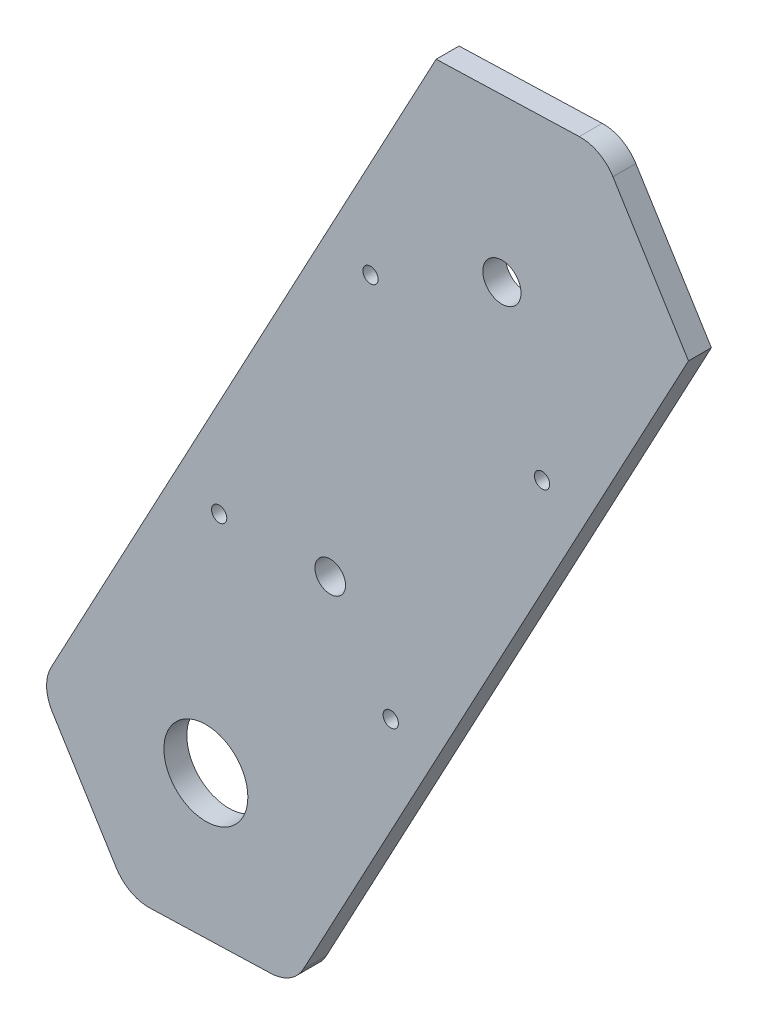
ISO-10303-21;
HEADER;
FILE_DESCRIPTION(('STEP AP214'),'2;1');
FILE_NAME('part.step','',(''),(''),'','','');
FILE_SCHEMA(('AUTOMOTIVE_DESIGN { 1 0 10303 214 1 1 1 1 }'));
ENDSEC;
DATA;
#1=APPLICATION_CONTEXT('core data for automotive mechanical design processes');
#2=APPLICATION_PROTOCOL_DEFINITION('international standard','automotive_design',2000,#1);
#3=PRODUCT_CONTEXT('',#1,'mechanical');
#4=PRODUCT('Part','Part','',(#3));
#5=PRODUCT_RELATED_PRODUCT_CATEGORY('part','',(#4));
#6=PRODUCT_DEFINITION_FORMATION('','',#4);
#7=PRODUCT_DEFINITION_CONTEXT('part definition',#1,'design');
#8=PRODUCT_DEFINITION('design','',#6,#7);
#9=PRODUCT_DEFINITION_SHAPE('','',#8);
#10=(LENGTH_UNIT() NAMED_UNIT(*) SI_UNIT(.MILLI.,.METRE.));
#11=(NAMED_UNIT(*) PLANE_ANGLE_UNIT() SI_UNIT($,.RADIAN.));
#12=(NAMED_UNIT(*) SI_UNIT($,.STERADIAN.) SOLID_ANGLE_UNIT());
#13=UNCERTAINTY_MEASURE_WITH_UNIT(LENGTH_MEASURE(1.E-05),#10,'distance_accuracy_value','');
#14=(GEOMETRIC_REPRESENTATION_CONTEXT(3) GLOBAL_UNCERTAINTY_ASSIGNED_CONTEXT((#13)) GLOBAL_UNIT_ASSIGNED_CONTEXT((#10,
#11,#12)) REPRESENTATION_CONTEXT('',''));
#15=CARTESIAN_POINT('',(0.,0.,0.));
#16=DIRECTION('',(0.,0.,1.));
#17=DIRECTION('',(1.,0.,0.));
#18=AXIS2_PLACEMENT_3D('',#15,#16,#17);
#19=CARTESIAN_POINT('',(-59.7156540331913,92.8676336023535,6.));
#20=DIRECTION('',(0.,0.,1.));
#21=DIRECTION('',(1.,0.,0.));
#22=AXIS2_PLACEMENT_3D('',#19,#20,#21);
#23=PLANE('',#22);
#24=CARTESIAN_POINT('',(-72.9831925429008,180.369292488009,6.));
#25=DIRECTION('',(0.,0.,1.));
#26=DIRECTION('',(1.,0.,0.));
#27=AXIS2_PLACEMENT_3D('',#24,#25,#26);
#28=CIRCLE('',#27,2.00000000000215);
#29=CARTESIAN_POINT('',(-70.9831925428986,180.369292488009,6.));
#30=VERTEX_POINT('',#29);
#31=EDGE_CURVE('E244',#30,#30,#28,.T.);
#32=ORIENTED_EDGE('',*,*,#31,.F.);
#33=EDGE_LOOP('',(#32));
#34=FACE_BOUND('',#33,.T.);
#35=CARTESIAN_POINT('',(-28.0225409238831,156.295659484383,6.));
#36=DIRECTION('',(0.,0.,1.));
#37=DIRECTION('',(1.,0.,0.));
#38=AXIS2_PLACEMENT_3D('',#35,#36,#37);
#39=CIRCLE('',#38,1.99999999999847);
#40=CARTESIAN_POINT('',(-26.0225409238846,156.295659484383,6.));
#41=VERTEX_POINT('',#40);
#42=EDGE_CURVE('E232',#41,#41,#39,.T.);
#43=ORIENTED_EDGE('',*,*,#42,.F.);
#44=EDGE_LOOP('',(#43));
#45=FACE_BOUND('',#44,.T.);
#46=CARTESIAN_POINT('',(-33.3325028898582,254.422130448743,6.));
#47=DIRECTION('',(0.,0.,1.));
#48=DIRECTION('',(1.,0.,0.));
#49=AXIS2_PLACEMENT_3D('',#46,#47,#48);
#50=CIRCLE('',#49,2.0000000000014);
#51=CARTESIAN_POINT('',(-31.3325028898568,254.422130448743,6.));
#52=VERTEX_POINT('',#51);
#53=EDGE_CURVE('E220',#52,#52,#50,.T.);
#54=ORIENTED_EDGE('',*,*,#53,.F.);
#55=EDGE_LOOP('',(#54));
#56=FACE_BOUND('',#55,.T.);
#57=CARTESIAN_POINT('',(-59.7156540331913,92.8676336023535,6.));
#58=DIRECTION('',(0.,0.,1.));
#59=DIRECTION('',(1.,0.,0.));
#60=AXIS2_PLACEMENT_3D('',#57,#58,#59);
#61=CIRCLE('',#60,9.99999999999937);
#62=CARTESIAN_POINT('',(-59.3956642161356,82.8727545877296,6.));
#63=VERTEX_POINT('',#62);
#64=CARTESIAN_POINT('',(-50.8998399902472,88.1473134055641,6.));
#65=VERTEX_POINT('',#64);
#66=EDGE_CURVE('E169',#63,#65,#61,.T.);
#67=ORIENTED_EDGE('',*,*,#66,.T.);
#68=DIRECTION('',(0.472032019678965,0.881581404294463,0.));
#69=VECTOR('',#68,1.);
#70=CARTESIAN_POINT('',(-50.8998399902472,88.1473134055641,6.));
#71=LINE('',#70,#69);
#72=CARTESIAN_POINT('',(49.9944768524182,276.58061839191,6.));
#73=VERTEX_POINT('',#72);
#74=EDGE_CURVE('E107',#65,#73,#71,.T.);
#75=ORIENTED_EDGE('',*,*,#74,.T.);
#76=DIRECTION('',(-0.52745588178346,0.849582422588905,0.));
#77=VECTOR('',#76,1.);
#78=CARTESIAN_POINT('',(49.9944768524182,276.58061839191,6.));
#79=LINE('',#78,#77);
#80=CARTESIAN_POINT('',(30.200235155752,308.463550016641,6.));
#81=VERTEX_POINT('',#80);
#82=EDGE_CURVE('E190',#73,#81,#79,.T.);
#83=ORIENTED_EDGE('',*,*,#82,.T.);
#84=CARTESIAN_POINT('',(21.7044109298635,303.188991198806,6.));
#85=DIRECTION('',(0.,0.,1.));
#86=DIRECTION('',(1.,0.,0.));
#87=AXIS2_PLACEMENT_3D('',#84,#85,#86);
#88=CIRCLE('',#87,9.9999999999994);
#89=CARTESIAN_POINT('',(21.384421112808,313.18387021343,6.));
#90=VERTEX_POINT('',#89);
#91=EDGE_CURVE('E209',#81,#90,#88,.T.);
#92=ORIENTED_EDGE('',*,*,#91,.T.);
#93=DIRECTION('',(-0.999487901462448,-0.0319989817055542,0.));
#94=VECTOR('',#93,1.);
#95=CARTESIAN_POINT('',(21.384421112808,313.18387021343,6.));
#96=LINE('',#95,#94);
#97=CARTESIAN_POINT('',(-16.124128469664,311.983019867833,6.));
#98=VERTEX_POINT('',#97);
#99=EDGE_CURVE('E206',#90,#98,#96,.T.);
#100=ORIENTED_EDGE('',*,*,#99,.T.);
#101=DIRECTION('',(-0.472032019678973,-0.881581404294459,0.));
#102=VECTOR('',#101,1.);
#103=CARTESIAN_POINT('',(-117.018445312331,123.549714881488,6.));
#104=LINE('',#103,#102);
#105=CARTESIAN_POINT('',(-117.01844531233,123.549714881488,6.));
#106=VERTEX_POINT('',#105);
#107=EDGE_CURVE('E208',#98,#106,#104,.T.);
#108=ORIENTED_EDGE('',*,*,#107,.T.);
#109=CARTESIAN_POINT('',(-108.202631269388,118.829394684697,6.));
#110=DIRECTION('',(0.,0.,1.));
#111=DIRECTION('',(1.,0.,0.));
#112=AXIS2_PLACEMENT_3D('',#109,#110,#111);
#113=CIRCLE('',#112,9.99999999999877);
#114=CARTESIAN_POINT('',(-116.698455495276,113.554835866865,6.));
#115=VERTEX_POINT('',#114);
#116=EDGE_CURVE('E132',#106,#115,#113,.T.);
#117=ORIENTED_EDGE('',*,*,#116,.T.);
#118=DIRECTION('',(0.527455881783426,-0.849582422588926,0.));
#119=VECTOR('',#118,1.);
#120=CARTESIAN_POINT('',(-116.698455495276,113.554835866865,6.));
#121=LINE('',#120,#119);
#122=CARTESIAN_POINT('',(-99.9494817519435,86.5769706459374,6.));
#123=VERTEX_POINT('',#122);
#124=EDGE_CURVE('E126',#115,#123,#121,.T.);
#125=ORIENTED_EDGE('',*,*,#124,.T.);
#126=CARTESIAN_POINT('',(-91.4536575260571,91.8515294637753,6.));
#127=DIRECTION('',(0.,0.,1.));
#128=DIRECTION('',(1.,0.,0.));
#129=AXIS2_PLACEMENT_3D('',#126,#127,#128);
#130=CIRCLE('',#129,9.99999999999952);
#131=CARTESIAN_POINT('',(-91.1336677089969,81.8566504491513,6.));
#132=VERTEX_POINT('',#131);
#133=EDGE_CURVE('E130',#123,#132,#130,.T.);
#134=ORIENTED_EDGE('',*,*,#133,.T.);
#135=DIRECTION('',(0.999487901462452,0.0319989817054318,0.));
#136=VECTOR('',#135,1.);
#137=CARTESIAN_POINT('',(-91.1336677089969,81.8566504491513,6.));
#138=LINE('',#137,#136);
#139=EDGE_CURVE('E58',#132,#63,#138,.T.);
#140=ORIENTED_EDGE('',*,*,#139,.T.);
#141=EDGE_LOOP('',(#67,#75,#83,#92,#100,#108,#117,#125,#134,#140));
#142=FACE_BOUND('',#141,.T.);
#143=CARTESIAN_POINT('',(1.1048299992864,270.012836124958,6.));
#144=DIRECTION('',(0.,0.,1.));
#145=DIRECTION('',(1.,0.,0.));
#146=AXIS2_PLACEMENT_3D('',#143,#144,#145);
#147=CIRCLE('',#146,4.99999999999693);
#148=CARTESIAN_POINT('',(6.10482999928334,270.012836124958,6.));
#149=VERTEX_POINT('',#148);
#150=EDGE_CURVE('E154',#149,#149,#147,.T.);
#151=ORIENTED_EDGE('',*,*,#150,.F.);
#152=EDGE_LOOP('',(#151));
#153=FACE_BOUND('',#152,.T.);
#154=CARTESIAN_POINT('',(11.6281487291572,230.348497445116,6.));
#155=DIRECTION('',(0.,0.,1.));
#156=DIRECTION('',(1.,0.,0.));
#157=AXIS2_PLACEMENT_3D('',#154,#155,#156);
#158=CIRCLE('',#157,1.99999999999782);
#159=CARTESIAN_POINT('',(13.628148729155,230.348497445116,6.));
#160=VERTEX_POINT('',#159);
#161=EDGE_CURVE('E226',#160,#160,#158,.T.);
#162=ORIENTED_EDGE('',*,*,#161,.F.);
#163=EDGE_LOOP('',(#162));
#164=FACE_BOUND('',#163,.T.);
#165=CARTESIAN_POINT('',(-43.8796651517053,180.702169371145,6.));
#166=DIRECTION('',(0.,0.,1.));
#167=DIRECTION('',(1.,0.,0.));
#168=AXIS2_PLACEMENT_3D('',#165,#166,#167);
#169=CIRCLE('',#168,3.99999999999994);
#170=CARTESIAN_POINT('',(-39.8796651517053,180.702169371145,6.));
#171=VERTEX_POINT('',#170);
#172=EDGE_CURVE('E238',#171,#171,#169,.T.);
#173=ORIENTED_EDGE('',*,*,#172,.F.);
#174=EDGE_LOOP('',(#173));
#175=FACE_BOUND('',#174,.T.);
#176=CARTESIAN_POINT('',(-76.4646277765064,119.845498823277,6.));
#177=DIRECTION('',(0.,0.,1.));
#178=DIRECTION('',(1.,0.,0.));
#179=AXIS2_PLACEMENT_3D('',#176,#177,#178);
#180=CIRCLE('',#179,10.9999999999995);
#181=CARTESIAN_POINT('',(-65.4646277765069,119.845498823277,6.));
#182=VERTEX_POINT('',#181);
#183=EDGE_CURVE('E250',#182,#182,#180,.T.);
#184=ORIENTED_EDGE('',*,*,#183,.F.);
#185=EDGE_LOOP('',(#184));
#186=FACE_BOUND('',#185,.T.);
#187=ADVANCED_FACE('F41',(#34,#45,#56,#142,#153,#164,#175,#186),#23,.T.);
#188=CARTESIAN_POINT('',(-59.7156540331913,92.8676336023535,0.));
#189=DIRECTION('',(0.,0.,1.));
#190=DIRECTION('',(1.,0.,0.));
#191=AXIS2_PLACEMENT_3D('',#188,#189,#190);
#192=PLANE('',#191);
#193=CARTESIAN_POINT('',(-59.7156540331913,92.8676336023535,0.));
#194=DIRECTION('',(0.,0.,1.));
#195=DIRECTION('',(1.,0.,0.));
#196=AXIS2_PLACEMENT_3D('',#193,#194,#195);
#197=CIRCLE('',#196,9.99999999999937);
#198=CARTESIAN_POINT('',(-59.3956642161356,82.8727545877296,0.));
#199=VERTEX_POINT('',#198);
#200=CARTESIAN_POINT('',(-50.8998399902472,88.1473134055641,0.));
#201=VERTEX_POINT('',#200);
#202=EDGE_CURVE('E150',#199,#201,#197,.T.);
#203=ORIENTED_EDGE('',*,*,#202,.F.);
#204=DIRECTION('',(0.999487901462452,0.0319989817054318,0.));
#205=VECTOR('',#204,1.);
#206=CARTESIAN_POINT('',(-91.1336677089969,81.8566504491513,0.));
#207=LINE('',#206,#205);
#208=CARTESIAN_POINT('',(-91.1336677089969,81.8566504491513,0.));
#209=VERTEX_POINT('',#208);
#210=EDGE_CURVE('E99',#209,#199,#207,.T.);
#211=ORIENTED_EDGE('',*,*,#210,.F.);
#212=CARTESIAN_POINT('',(-91.4536575260571,91.8515294637753,0.));
#213=DIRECTION('',(0.,0.,1.));
#214=DIRECTION('',(1.,0.,0.));
#215=AXIS2_PLACEMENT_3D('',#212,#213,#214);
#216=CIRCLE('',#215,9.99999999999952);
#217=CARTESIAN_POINT('',(-99.9494817519435,86.5769706459374,0.));
#218=VERTEX_POINT('',#217);
#219=EDGE_CURVE('E93',#218,#209,#216,.T.);
#220=ORIENTED_EDGE('',*,*,#219,.F.);
#221=DIRECTION('',(0.527455881783426,-0.849582422588926,0.));
#222=VECTOR('',#221,1.);
#223=CARTESIAN_POINT('',(-116.698455495276,113.554835866865,0.));
#224=LINE('',#223,#222);
#225=CARTESIAN_POINT('',(-116.698455495276,113.554835866865,0.));
#226=VERTEX_POINT('',#225);
#227=EDGE_CURVE('E140',#226,#218,#224,.T.);
#228=ORIENTED_EDGE('',*,*,#227,.F.);
#229=CARTESIAN_POINT('',(-108.202631269388,118.829394684697,0.));
#230=DIRECTION('',(0.,0.,1.));
#231=DIRECTION('',(1.,0.,0.));
#232=AXIS2_PLACEMENT_3D('',#229,#230,#231);
#233=CIRCLE('',#232,9.99999999999877);
#234=CARTESIAN_POINT('',(-117.01844531233,123.549714881488,0.));
#235=VERTEX_POINT('',#234);
#236=EDGE_CURVE('E164',#235,#226,#233,.T.);
#237=ORIENTED_EDGE('',*,*,#236,.F.);
#238=DIRECTION('',(-0.472032019678973,-0.881581404294459,0.));
#239=VECTOR('',#238,1.);
#240=CARTESIAN_POINT('',(-117.018445312331,123.549714881488,0.));
#241=LINE('',#240,#239);
#242=CARTESIAN_POINT('',(-16.124128469664,311.983019867833,0.));
#243=VERTEX_POINT('',#242);
#244=EDGE_CURVE('E162',#243,#235,#241,.T.);
#245=ORIENTED_EDGE('',*,*,#244,.F.);
#246=DIRECTION('',(-0.999487901462448,-0.0319989817055542,0.));
#247=VECTOR('',#246,1.);
#248=CARTESIAN_POINT('',(21.384421112808,313.18387021343,0.));
#249=LINE('',#248,#247);
#250=CARTESIAN_POINT('',(21.384421112808,313.18387021343,0.));
#251=VERTEX_POINT('',#250);
#252=EDGE_CURVE('E160',#251,#243,#249,.T.);
#253=ORIENTED_EDGE('',*,*,#252,.F.);
#254=CARTESIAN_POINT('',(21.7044109298635,303.188991198806,0.));
#255=DIRECTION('',(0.,0.,1.));
#256=DIRECTION('',(1.,0.,0.));
#257=AXIS2_PLACEMENT_3D('',#254,#255,#256);
#258=CIRCLE('',#257,9.9999999999994);
#259=CARTESIAN_POINT('',(30.200235155752,308.463550016641,0.));
#260=VERTEX_POINT('',#259);
#261=EDGE_CURVE('E158',#260,#251,#258,.T.);
#262=ORIENTED_EDGE('',*,*,#261,.F.);
#263=DIRECTION('',(-0.52745588178346,0.849582422588905,0.));
#264=VECTOR('',#263,1.);
#265=CARTESIAN_POINT('',(49.9944768524182,276.58061839191,0.));
#266=LINE('',#265,#264);
#267=CARTESIAN_POINT('',(49.9944768524182,276.58061839191,0.));
#268=VERTEX_POINT('',#267);
#269=EDGE_CURVE('E156',#268,#260,#266,.T.);
#270=ORIENTED_EDGE('',*,*,#269,.F.);
#271=DIRECTION('',(0.472032019678965,0.881581404294463,0.));
#272=VECTOR('',#271,1.);
#273=CARTESIAN_POINT('',(-50.8998399902472,88.1473134055641,0.));
#274=LINE('',#273,#272);
#275=EDGE_CURVE('E153',#201,#268,#274,.T.);
#276=ORIENTED_EDGE('',*,*,#275,.F.);
#277=EDGE_LOOP('',(#203,#211,#220,#228,#237,#245,#253,#262,#270,#276));
#278=FACE_BOUND('',#277,.T.);
#279=CARTESIAN_POINT('',(1.1048299992864,270.012836124958,0.));
#280=DIRECTION('',(0.,0.,1.));
#281=DIRECTION('',(1.,0.,0.));
#282=AXIS2_PLACEMENT_3D('',#279,#280,#281);
#283=CIRCLE('',#282,4.99999999999693);
#284=CARTESIAN_POINT('',(6.10482999928334,270.012836124958,0.));
#285=VERTEX_POINT('',#284);
#286=EDGE_CURVE('E217',#285,#285,#283,.T.);
#287=ORIENTED_EDGE('',*,*,#286,.T.);
#288=EDGE_LOOP('',(#287));
#289=FACE_BOUND('',#288,.T.);
#290=CARTESIAN_POINT('',(-33.3325028898582,254.422130448743,0.));
#291=DIRECTION('',(0.,0.,1.));
#292=DIRECTION('',(1.,0.,0.));
#293=AXIS2_PLACEMENT_3D('',#290,#291,#292);
#294=CIRCLE('',#293,2.0000000000014);
#295=CARTESIAN_POINT('',(-31.3325028898568,254.422130448743,0.));
#296=VERTEX_POINT('',#295);
#297=EDGE_CURVE('E223',#296,#296,#294,.T.);
#298=ORIENTED_EDGE('',*,*,#297,.T.);
#299=EDGE_LOOP('',(#298));
#300=FACE_BOUND('',#299,.T.);
#301=CARTESIAN_POINT('',(11.6281487291572,230.348497445116,0.));
#302=DIRECTION('',(0.,0.,1.));
#303=DIRECTION('',(1.,0.,0.));
#304=AXIS2_PLACEMENT_3D('',#301,#302,#303);
#305=CIRCLE('',#304,1.99999999999782);
#306=CARTESIAN_POINT('',(13.628148729155,230.348497445116,0.));
#307=VERTEX_POINT('',#306);
#308=EDGE_CURVE('E229',#307,#307,#305,.T.);
#309=ORIENTED_EDGE('',*,*,#308,.T.);
#310=EDGE_LOOP('',(#309));
#311=FACE_BOUND('',#310,.T.);
#312=CARTESIAN_POINT('',(-28.0225409238831,156.295659484383,0.));
#313=DIRECTION('',(0.,0.,1.));
#314=DIRECTION('',(1.,0.,0.));
#315=AXIS2_PLACEMENT_3D('',#312,#313,#314);
#316=CIRCLE('',#315,1.99999999999847);
#317=CARTESIAN_POINT('',(-26.0225409238846,156.295659484383,0.));
#318=VERTEX_POINT('',#317);
#319=EDGE_CURVE('E235',#318,#318,#316,.T.);
#320=ORIENTED_EDGE('',*,*,#319,.T.);
#321=EDGE_LOOP('',(#320));
#322=FACE_BOUND('',#321,.T.);
#323=CARTESIAN_POINT('',(-43.8796651517053,180.702169371145,0.));
#324=DIRECTION('',(0.,0.,1.));
#325=DIRECTION('',(1.,0.,0.));
#326=AXIS2_PLACEMENT_3D('',#323,#324,#325);
#327=CIRCLE('',#326,3.99999999999994);
#328=CARTESIAN_POINT('',(-39.8796651517053,180.702169371145,0.));
#329=VERTEX_POINT('',#328);
#330=EDGE_CURVE('E241',#329,#329,#327,.T.);
#331=ORIENTED_EDGE('',*,*,#330,.T.);
#332=EDGE_LOOP('',(#331));
#333=FACE_BOUND('',#332,.T.);
#334=CARTESIAN_POINT('',(-72.9831925429008,180.369292488009,0.));
#335=DIRECTION('',(0.,0.,1.));
#336=DIRECTION('',(1.,0.,0.));
#337=AXIS2_PLACEMENT_3D('',#334,#335,#336);
#338=CIRCLE('',#337,2.00000000000215);
#339=CARTESIAN_POINT('',(-70.9831925428986,180.369292488009,0.));
#340=VERTEX_POINT('',#339);
#341=EDGE_CURVE('E247',#340,#340,#338,.T.);
#342=ORIENTED_EDGE('',*,*,#341,.T.);
#343=EDGE_LOOP('',(#342));
#344=FACE_BOUND('',#343,.T.);
#345=CARTESIAN_POINT('',(-76.4646277765064,119.845498823277,0.));
#346=DIRECTION('',(0.,0.,1.));
#347=DIRECTION('',(1.,0.,0.));
#348=AXIS2_PLACEMENT_3D('',#345,#346,#347);
#349=CIRCLE('',#348,10.9999999999995);
#350=CARTESIAN_POINT('',(-65.4646277765069,119.845498823277,0.));
#351=VERTEX_POINT('',#350);
#352=EDGE_CURVE('E253',#351,#351,#349,.T.);
#353=ORIENTED_EDGE('',*,*,#352,.T.);
#354=EDGE_LOOP('',(#353));
#355=FACE_BOUND('',#354,.T.);
#356=ADVANCED_FACE('F194',(#278,#289,#300,#311,#322,#333,#344,#355),#192,.F.);
#357=CARTESIAN_POINT('',(-59.7156540331913,92.8676336023535,6.));
#358=DIRECTION('',(0.,0.,-1.));
#359=DIRECTION('',(-1.,0.,0.));
#360=AXIS2_PLACEMENT_3D('',#357,#358,#359);
#361=CYLINDRICAL_SURFACE('',#360,9.99999999999937);
#362=ORIENTED_EDGE('',*,*,#202,.T.);
#363=DIRECTION('',(0.,0.,-1.));
#364=VECTOR('',#363,1.);
#365=CARTESIAN_POINT('',(-50.8998399902472,88.1473134055641,6.));
#366=LINE('',#365,#364);
#367=EDGE_CURVE('E11',#65,#201,#366,.T.);
#368=ORIENTED_EDGE('',*,*,#367,.F.);
#369=ORIENTED_EDGE('',*,*,#66,.F.);
#370=DIRECTION('',(0.,0.,-1.));
#371=VECTOR('',#370,1.);
#372=CARTESIAN_POINT('',(-59.3956642161356,82.8727545877296,6.));
#373=LINE('',#372,#371);
#374=EDGE_CURVE('E146',#63,#199,#373,.T.);
#375=ORIENTED_EDGE('',*,*,#374,.T.);
#376=EDGE_LOOP('',(#362,#368,#369,#375));
#377=FACE_BOUND('',#376,.T.);
#378=ADVANCED_FACE('F43',(#377),#361,.T.);
#379=CARTESIAN_POINT('',(-50.8998399902472,88.1473134055641,6.));
#380=DIRECTION('',(-0.881581404294463,0.472032019678966,0.));
#381=DIRECTION('',(-0.472032019678966,-0.881581404294463,0.));
#382=AXIS2_PLACEMENT_3D('',#379,#380,#381);
#383=PLANE('',#382);
#384=ORIENTED_EDGE('',*,*,#275,.T.);
#385=DIRECTION('',(0.,0.,-1.));
#386=VECTOR('',#385,1.);
#387=CARTESIAN_POINT('',(49.9944768524182,276.58061839191,6.));
#388=LINE('',#387,#386);
#389=EDGE_CURVE('E50',#73,#268,#388,.T.);
#390=ORIENTED_EDGE('',*,*,#389,.F.);
#391=ORIENTED_EDGE('',*,*,#74,.F.);
#392=ORIENTED_EDGE('',*,*,#367,.T.);
#393=EDGE_LOOP('',(#384,#390,#391,#392));
#394=FACE_BOUND('',#393,.T.);
#395=ADVANCED_FACE('F295',(#394),#383,.F.);
#396=CARTESIAN_POINT('',(49.9944768524182,276.58061839191,6.));
#397=DIRECTION('',(-0.849582422588905,-0.52745588178346,0.));
#398=DIRECTION('',(0.52745588178346,-0.849582422588905,0.));
#399=AXIS2_PLACEMENT_3D('',#396,#397,#398);
#400=PLANE('',#399);
#401=ORIENTED_EDGE('',*,*,#269,.T.);
#402=DIRECTION('',(0.,0.,-1.));
#403=VECTOR('',#402,1.);
#404=CARTESIAN_POINT('',(30.200235155752,308.463550016641,6.));
#405=LINE('',#404,#403);
#406=EDGE_CURVE('E182',#81,#260,#405,.T.);
#407=ORIENTED_EDGE('',*,*,#406,.F.);
#408=ORIENTED_EDGE('',*,*,#82,.F.);
#409=ORIENTED_EDGE('',*,*,#389,.T.);
#410=EDGE_LOOP('',(#401,#407,#408,#409));
#411=FACE_BOUND('',#410,.T.);
#412=ADVANCED_FACE('F188',(#411),#400,.F.);
#413=CARTESIAN_POINT('',(21.7044109298635,303.188991198806,6.));
#414=DIRECTION('',(0.,0.,-1.));
#415=DIRECTION('',(-1.,0.,0.));
#416=AXIS2_PLACEMENT_3D('',#413,#414,#415);
#417=CYLINDRICAL_SURFACE('',#416,9.9999999999994);
#418=ORIENTED_EDGE('',*,*,#261,.T.);
#419=DIRECTION('',(0.,0.,-1.));
#420=VECTOR('',#419,1.);
#421=CARTESIAN_POINT('',(21.384421112808,313.18387021343,6.));
#422=LINE('',#421,#420);
#423=EDGE_CURVE('E179',#90,#251,#422,.T.);
#424=ORIENTED_EDGE('',*,*,#423,.F.);
#425=ORIENTED_EDGE('',*,*,#91,.F.);
#426=ORIENTED_EDGE('',*,*,#406,.T.);
#427=EDGE_LOOP('',(#418,#424,#425,#426));
#428=FACE_BOUND('',#427,.T.);
#429=ADVANCED_FACE('F200',(#428),#417,.T.);
#430=CARTESIAN_POINT('',(21.384421112808,313.18387021343,6.));
#431=DIRECTION('',(0.0319989817055542,-0.999487901462448,0.));
#432=DIRECTION('',(0.999487901462448,0.0319989817055542,0.));
#433=AXIS2_PLACEMENT_3D('',#430,#431,#432);
#434=PLANE('',#433);
#435=ORIENTED_EDGE('',*,*,#252,.T.);
#436=DIRECTION('',(0.,0.,-1.));
#437=VECTOR('',#436,1.);
#438=CARTESIAN_POINT('',(-16.124128469664,311.983019867833,6.));
#439=LINE('',#438,#437);
#440=EDGE_CURVE('E176',#98,#243,#439,.T.);
#441=ORIENTED_EDGE('',*,*,#440,.F.);
#442=ORIENTED_EDGE('',*,*,#99,.F.);
#443=ORIENTED_EDGE('',*,*,#423,.T.);
#444=EDGE_LOOP('',(#435,#441,#442,#443));
#445=FACE_BOUND('',#444,.T.);
#446=ADVANCED_FACE('F204',(#445),#434,.F.);
#447=CARTESIAN_POINT('',(-117.018445312331,123.549714881488,6.));
#448=DIRECTION('',(0.881581404294459,-0.472032019678973,0.));
#449=DIRECTION('',(0.472032019678973,0.881581404294459,0.));
#450=AXIS2_PLACEMENT_3D('',#447,#448,#449);
#451=PLANE('',#450);
#452=ORIENTED_EDGE('',*,*,#244,.T.);
#453=DIRECTION('',(0.,0.,-1.));
#454=VECTOR('',#453,1.);
#455=CARTESIAN_POINT('',(-117.01844531233,123.549714881488,6.));
#456=LINE('',#455,#454);
#457=EDGE_CURVE('E173',#106,#235,#456,.T.);
#458=ORIENTED_EDGE('',*,*,#457,.F.);
#459=ORIENTED_EDGE('',*,*,#107,.F.);
#460=ORIENTED_EDGE('',*,*,#440,.T.);
#461=EDGE_LOOP('',(#452,#458,#459,#460));
#462=FACE_BOUND('',#461,.T.);
#463=ADVANCED_FACE('F285',(#462),#451,.F.);
#464=CARTESIAN_POINT('',(-108.202631269388,118.829394684697,6.));
#465=DIRECTION('',(0.,0.,-1.));
#466=DIRECTION('',(-1.,0.,0.));
#467=AXIS2_PLACEMENT_3D('',#464,#465,#466);
#468=CYLINDRICAL_SURFACE('',#467,9.99999999999877);
#469=ORIENTED_EDGE('',*,*,#236,.T.);
#470=DIRECTION('',(0.,0.,-1.));
#471=VECTOR('',#470,1.);
#472=CARTESIAN_POINT('',(-116.698455495276,113.554835866865,6.));
#473=LINE('',#472,#471);
#474=EDGE_CURVE('E141',#115,#226,#473,.T.);
#475=ORIENTED_EDGE('',*,*,#474,.F.);
#476=ORIENTED_EDGE('',*,*,#116,.F.);
#477=ORIENTED_EDGE('',*,*,#457,.T.);
#478=EDGE_LOOP('',(#469,#475,#476,#477));
#479=FACE_BOUND('',#478,.T.);
#480=ADVANCED_FACE('F282',(#479),#468,.T.);
#481=CARTESIAN_POINT('',(-116.698455495276,113.554835866865,6.));
#482=DIRECTION('',(0.849582422588926,0.527455881783426,0.));
#483=DIRECTION('',(-0.527455881783426,0.849582422588926,0.));
#484=AXIS2_PLACEMENT_3D('',#481,#482,#483);
#485=PLANE('',#484);
#486=ORIENTED_EDGE('',*,*,#227,.T.);
#487=DIRECTION('',(0.,0.,-1.));
#488=VECTOR('',#487,1.);
#489=CARTESIAN_POINT('',(-99.9494817519435,86.5769706459374,6.));
#490=LINE('',#489,#488);
#491=EDGE_CURVE('E137',#123,#218,#490,.T.);
#492=ORIENTED_EDGE('',*,*,#491,.F.);
#493=ORIENTED_EDGE('',*,*,#124,.F.);
#494=ORIENTED_EDGE('',*,*,#474,.T.);
#495=EDGE_LOOP('',(#486,#492,#493,#494));
#496=FACE_BOUND('',#495,.T.);
#497=ADVANCED_FACE('F138',(#496),#485,.F.);
#498=CARTESIAN_POINT('',(-91.4536575260571,91.8515294637753,6.));
#499=DIRECTION('',(0.,0.,-1.));
#500=DIRECTION('',(-1.,0.,0.));
#501=AXIS2_PLACEMENT_3D('',#498,#499,#500);
#502=CYLINDRICAL_SURFACE('',#501,9.99999999999952);
#503=ORIENTED_EDGE('',*,*,#219,.T.);
#504=DIRECTION('',(0.,0.,-1.));
#505=VECTOR('',#504,1.);
#506=CARTESIAN_POINT('',(-91.1336677089969,81.8566504491513,6.));
#507=LINE('',#506,#505);
#508=EDGE_CURVE('E142',#132,#209,#507,.T.);
#509=ORIENTED_EDGE('',*,*,#508,.F.);
#510=ORIENTED_EDGE('',*,*,#133,.F.);
#511=ORIENTED_EDGE('',*,*,#491,.T.);
#512=EDGE_LOOP('',(#503,#509,#510,#511));
#513=FACE_BOUND('',#512,.T.);
#514=ADVANCED_FACE('F144',(#513),#502,.T.);
#515=CARTESIAN_POINT('',(-91.1336677089969,81.8566504491513,6.));
#516=DIRECTION('',(-0.0319989817054318,0.999487901462452,0.));
#517=DIRECTION('',(-0.999487901462452,-0.0319989817054318,0.));
#518=AXIS2_PLACEMENT_3D('',#515,#516,#517);
#519=PLANE('',#518);
#520=ORIENTED_EDGE('',*,*,#210,.T.);
#521=ORIENTED_EDGE('',*,*,#374,.F.);
#522=ORIENTED_EDGE('',*,*,#139,.F.);
#523=ORIENTED_EDGE('',*,*,#508,.T.);
#524=EDGE_LOOP('',(#520,#521,#522,#523));
#525=FACE_BOUND('',#524,.T.);
#526=ADVANCED_FACE('F275',(#525),#519,.F.);
#527=CARTESIAN_POINT('',(1.1048299992864,270.012836124958,6.));
#528=DIRECTION('',(0.,0.,-1.));
#529=DIRECTION('',(-1.,0.,0.));
#530=AXIS2_PLACEMENT_3D('',#527,#528,#529);
#531=CYLINDRICAL_SURFACE('',#530,4.99999999999693);
#532=ORIENTED_EDGE('',*,*,#150,.T.);
#533=EDGE_LOOP('',(#532));
#534=FACE_BOUND('',#533,.T.);
#535=ORIENTED_EDGE('',*,*,#286,.F.);
#536=EDGE_LOOP('',(#535));
#537=FACE_BOUND('',#536,.T.);
#538=ADVANCED_FACE('F272',(#534,#537),#531,.F.);
#539=CARTESIAN_POINT('',(-33.3325028898582,254.422130448743,6.));
#540=DIRECTION('',(0.,0.,-1.));
#541=DIRECTION('',(-1.,0.,0.));
#542=AXIS2_PLACEMENT_3D('',#539,#540,#541);
#543=CYLINDRICAL_SURFACE('',#542,2.0000000000014);
#544=ORIENTED_EDGE('',*,*,#53,.T.);
#545=EDGE_LOOP('',(#544));
#546=FACE_BOUND('',#545,.T.);
#547=ORIENTED_EDGE('',*,*,#297,.F.);
#548=EDGE_LOOP('',(#547));
#549=FACE_BOUND('',#548,.T.);
#550=ADVANCED_FACE('F385',(#546,#549),#543,.F.);
#551=CARTESIAN_POINT('',(11.6281487291572,230.348497445116,6.));
#552=DIRECTION('',(0.,0.,-1.));
#553=DIRECTION('',(-1.,0.,0.));
#554=AXIS2_PLACEMENT_3D('',#551,#552,#553);
#555=CYLINDRICAL_SURFACE('',#554,1.99999999999782);
#556=ORIENTED_EDGE('',*,*,#161,.T.);
#557=EDGE_LOOP('',(#556));
#558=FACE_BOUND('',#557,.T.);
#559=ORIENTED_EDGE('',*,*,#308,.F.);
#560=EDGE_LOOP('',(#559));
#561=FACE_BOUND('',#560,.T.);
#562=ADVANCED_FACE('F394',(#558,#561),#555,.F.);
#563=CARTESIAN_POINT('',(-28.0225409238831,156.295659484383,6.));
#564=DIRECTION('',(0.,0.,-1.));
#565=DIRECTION('',(-1.,0.,0.));
#566=AXIS2_PLACEMENT_3D('',#563,#564,#565);
#567=CYLINDRICAL_SURFACE('',#566,1.99999999999847);
#568=ORIENTED_EDGE('',*,*,#42,.T.);
#569=EDGE_LOOP('',(#568));
#570=FACE_BOUND('',#569,.T.);
#571=ORIENTED_EDGE('',*,*,#319,.F.);
#572=EDGE_LOOP('',(#571));
#573=FACE_BOUND('',#572,.T.);
#574=ADVANCED_FACE('F403',(#570,#573),#567,.F.);
#575=CARTESIAN_POINT('',(-43.8796651517053,180.702169371145,6.));
#576=DIRECTION('',(0.,0.,-1.));
#577=DIRECTION('',(-1.,0.,0.));
#578=AXIS2_PLACEMENT_3D('',#575,#576,#577);
#579=CYLINDRICAL_SURFACE('',#578,3.99999999999994);
#580=ORIENTED_EDGE('',*,*,#172,.T.);
#581=EDGE_LOOP('',(#580));
#582=FACE_BOUND('',#581,.T.);
#583=ORIENTED_EDGE('',*,*,#330,.F.);
#584=EDGE_LOOP('',(#583));
#585=FACE_BOUND('',#584,.T.);
#586=ADVANCED_FACE('F413',(#582,#585),#579,.F.);
#587=CARTESIAN_POINT('',(-72.9831925429008,180.369292488009,6.));
#588=DIRECTION('',(0.,0.,-1.));
#589=DIRECTION('',(-1.,0.,0.));
#590=AXIS2_PLACEMENT_3D('',#587,#588,#589);
#591=CYLINDRICAL_SURFACE('',#590,2.00000000000215);
#592=ORIENTED_EDGE('',*,*,#31,.T.);
#593=EDGE_LOOP('',(#592));
#594=FACE_BOUND('',#593,.T.);
#595=ORIENTED_EDGE('',*,*,#341,.F.);
#596=EDGE_LOOP('',(#595));
#597=FACE_BOUND('',#596,.T.);
#598=ADVANCED_FACE('F423',(#594,#597),#591,.F.);
#599=CARTESIAN_POINT('',(-76.4646277765064,119.845498823277,6.));
#600=DIRECTION('',(0.,0.,-1.));
#601=DIRECTION('',(-1.,0.,0.));
#602=AXIS2_PLACEMENT_3D('',#599,#600,#601);
#603=CYLINDRICAL_SURFACE('',#602,10.9999999999995);
#604=ORIENTED_EDGE('',*,*,#183,.T.);
#605=EDGE_LOOP('',(#604));
#606=FACE_BOUND('',#605,.T.);
#607=ORIENTED_EDGE('',*,*,#352,.F.);
#608=EDGE_LOOP('',(#607));
#609=FACE_BOUND('',#608,.T.);
#610=ADVANCED_FACE('F259',(#606,#609),#603,.F.);
#611=CLOSED_SHELL('',(#187,#356,#378,#395,#412,#429,#446,#463,#480,#497,#514,#526,#538,#550,
#562,#574,#586,#598,#610));
#612=MANIFOLD_SOLID_BREP('B2',#611);
#613=ADVANCED_BREP_SHAPE_REPRESENTATION('',(#18,#612),#14);
#614=SHAPE_DEFINITION_REPRESENTATION(#9,#613);
ENDSEC;
END-ISO-10303-21;
